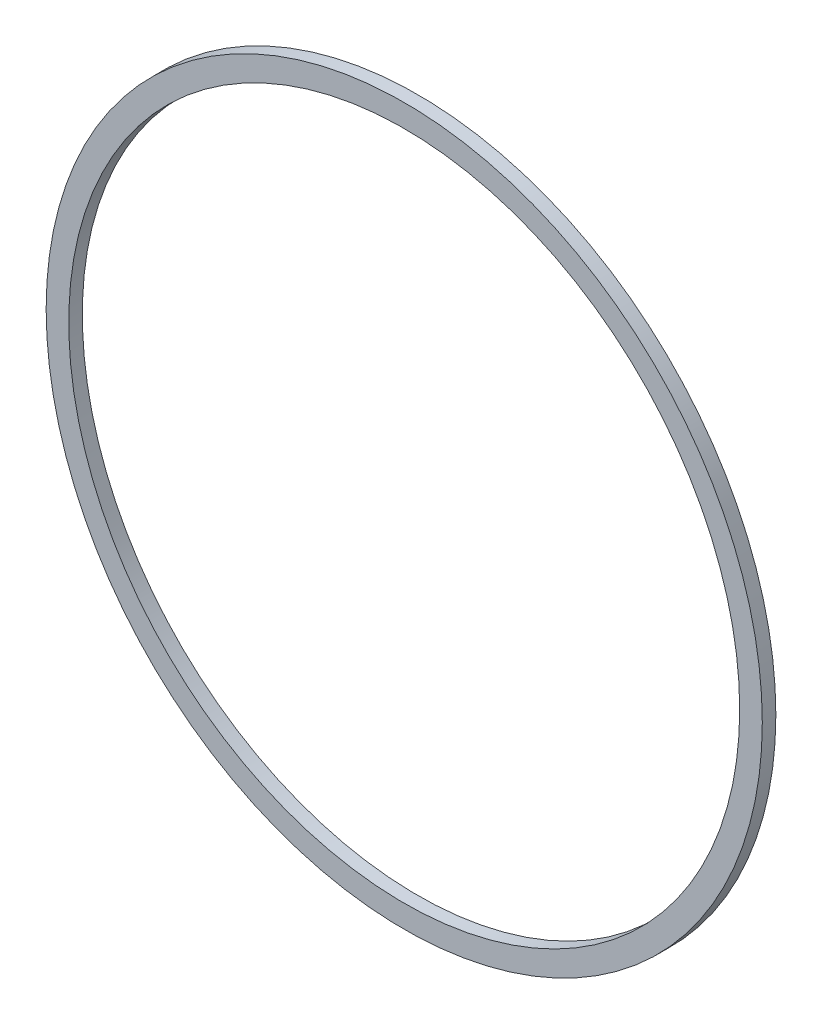
ISO-10303-21;
HEADER;
FILE_DESCRIPTION(('STEP AP214'),'2;1');
FILE_NAME('part.step','',(''),(''),'','','');
FILE_SCHEMA(('AUTOMOTIVE_DESIGN { 1 0 10303 214 1 1 1 1 }'));
ENDSEC;
DATA;
#1=APPLICATION_CONTEXT('core data for automotive mechanical design processes');
#2=APPLICATION_PROTOCOL_DEFINITION('international standard','automotive_design',2000,#1);
#3=PRODUCT_CONTEXT('',#1,'mechanical');
#4=PRODUCT('Part','Part','',(#3));
#5=PRODUCT_RELATED_PRODUCT_CATEGORY('part','',(#4));
#6=PRODUCT_DEFINITION_FORMATION('','',#4);
#7=PRODUCT_DEFINITION_CONTEXT('part definition',#1,'design');
#8=PRODUCT_DEFINITION('design','',#6,#7);
#9=PRODUCT_DEFINITION_SHAPE('','',#8);
#10=(LENGTH_UNIT() NAMED_UNIT(*) SI_UNIT(.MILLI.,.METRE.));
#11=(NAMED_UNIT(*) PLANE_ANGLE_UNIT() SI_UNIT($,.RADIAN.));
#12=(NAMED_UNIT(*) SI_UNIT($,.STERADIAN.) SOLID_ANGLE_UNIT());
#13=UNCERTAINTY_MEASURE_WITH_UNIT(LENGTH_MEASURE(1.E-05),#10,'distance_accuracy_value','');
#14=(GEOMETRIC_REPRESENTATION_CONTEXT(3) GLOBAL_UNCERTAINTY_ASSIGNED_CONTEXT((#13)) GLOBAL_UNIT_ASSIGNED_CONTEXT((#10,
#11,#12)) REPRESENTATION_CONTEXT('',''));
#15=CARTESIAN_POINT('',(0.,0.,0.));
#16=DIRECTION('',(0.,0.,1.));
#17=DIRECTION('',(1.,0.,0.));
#18=AXIS2_PLACEMENT_3D('',#15,#16,#17);
#19=CARTESIAN_POINT('',(0.,0.,0.6));
#20=DIRECTION('',(0.,0.,1.));
#21=DIRECTION('',(1.,0.,0.));
#22=AXIS2_PLACEMENT_3D('',#19,#20,#21);
#23=PLANE('',#22);
#24=CARTESIAN_POINT('',(0.,0.,0.6));
#25=DIRECTION('',(0.,0.,1.));
#26=DIRECTION('',(1.,0.,0.));
#27=AXIS2_PLACEMENT_3D('',#24,#25,#26);
#28=CIRCLE('',#27,15.85);
#29=CARTESIAN_POINT('',(15.85,0.,0.6));
#30=VERTEX_POINT('',#29);
#31=EDGE_CURVE('E10',#30,#30,#28,.T.);
#32=ORIENTED_EDGE('',*,*,#31,.T.);
#33=EDGE_LOOP('',(#32));
#34=FACE_BOUND('',#33,.T.);
#35=CARTESIAN_POINT('',(0.,0.,0.6));
#36=DIRECTION('',(0.,0.,1.));
#37=DIRECTION('',(1.,0.,0.));
#38=AXIS2_PLACEMENT_3D('',#35,#36,#37);
#39=CIRCLE('',#38,14.85);
#40=CARTESIAN_POINT('',(14.85,0.,0.6));
#41=VERTEX_POINT('',#40);
#42=EDGE_CURVE('E50',#41,#41,#39,.T.);
#43=ORIENTED_EDGE('',*,*,#42,.F.);
#44=EDGE_LOOP('',(#43));
#45=FACE_BOUND('',#44,.T.);
#46=ADVANCED_FACE('F37',(#34,#45),#23,.T.);
#47=CARTESIAN_POINT('',(0.,0.,0.));
#48=DIRECTION('',(0.,0.,1.));
#49=DIRECTION('',(1.,0.,0.));
#50=AXIS2_PLACEMENT_3D('',#47,#48,#49);
#51=PLANE('',#50);
#52=CARTESIAN_POINT('',(0.,0.,0.));
#53=DIRECTION('',(0.,0.,1.));
#54=DIRECTION('',(1.,0.,0.));
#55=AXIS2_PLACEMENT_3D('',#52,#53,#54);
#56=CIRCLE('',#55,15.85);
#57=CARTESIAN_POINT('',(15.85,0.,0.));
#58=VERTEX_POINT('',#57);
#59=EDGE_CURVE('E41',#58,#58,#56,.T.);
#60=ORIENTED_EDGE('',*,*,#59,.F.);
#61=EDGE_LOOP('',(#60));
#62=FACE_BOUND('',#61,.T.);
#63=CARTESIAN_POINT('',(0.,0.,0.));
#64=DIRECTION('',(0.,0.,1.));
#65=DIRECTION('',(1.,0.,0.));
#66=AXIS2_PLACEMENT_3D('',#63,#64,#65);
#67=CIRCLE('',#66,14.85);
#68=CARTESIAN_POINT('',(14.85,0.,0.));
#69=VERTEX_POINT('',#68);
#70=EDGE_CURVE('E52',#69,#69,#67,.T.);
#71=ORIENTED_EDGE('',*,*,#70,.T.);
#72=EDGE_LOOP('',(#71));
#73=FACE_BOUND('',#72,.T.);
#74=ADVANCED_FACE('F64',(#62,#73),#51,.F.);
#75=CARTESIAN_POINT('',(0.,0.,0.6));
#76=DIRECTION('',(0.,0.,-1.));
#77=DIRECTION('',(-1.,0.,0.));
#78=AXIS2_PLACEMENT_3D('',#75,#76,#77);
#79=CYLINDRICAL_SURFACE('',#78,15.85);
#80=ORIENTED_EDGE('',*,*,#31,.F.);
#81=EDGE_LOOP('',(#80));
#82=FACE_BOUND('',#81,.T.);
#83=ORIENTED_EDGE('',*,*,#59,.T.);
#84=EDGE_LOOP('',(#83));
#85=FACE_BOUND('',#84,.T.);
#86=ADVANCED_FACE('F39',(#82,#85),#79,.T.);
#87=CARTESIAN_POINT('',(0.,0.,0.6));
#88=DIRECTION('',(0.,0.,-1.));
#89=DIRECTION('',(-1.,0.,0.));
#90=AXIS2_PLACEMENT_3D('',#87,#88,#89);
#91=CYLINDRICAL_SURFACE('',#90,14.85);
#92=ORIENTED_EDGE('',*,*,#42,.T.);
#93=EDGE_LOOP('',(#92));
#94=FACE_BOUND('',#93,.T.);
#95=ORIENTED_EDGE('',*,*,#70,.F.);
#96=EDGE_LOOP('',(#95));
#97=FACE_BOUND('',#96,.T.);
#98=ADVANCED_FACE('F60',(#94,#97),#91,.F.);
#99=CLOSED_SHELL('',(#46,#74,#86,#98));
#100=MANIFOLD_SOLID_BREP('B2',#99);
#101=ADVANCED_BREP_SHAPE_REPRESENTATION('',(#18,#100),#14);
#102=SHAPE_DEFINITION_REPRESENTATION(#9,#101);
ENDSEC;
END-ISO-10303-21;
